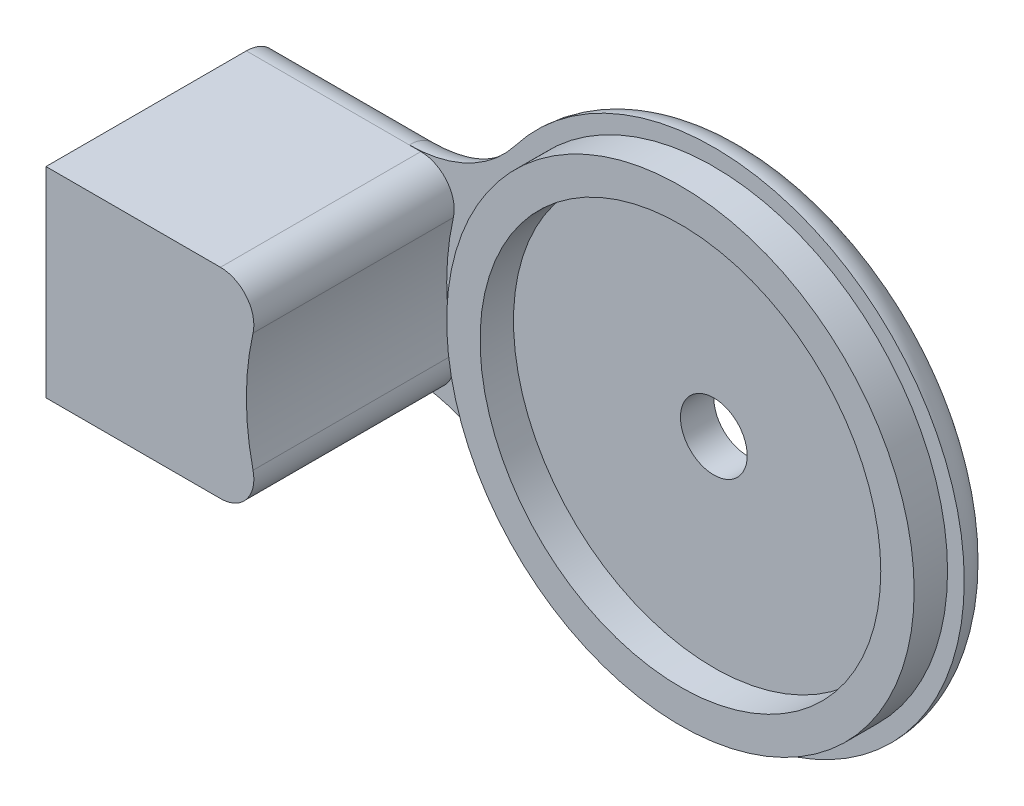
ISO-10303-21;
HEADER;
FILE_DESCRIPTION(('STEP AP214'),'2;1');
FILE_NAME('part.step','',(''),(''),'','','');
FILE_SCHEMA(('AUTOMOTIVE_DESIGN { 1 0 10303 214 1 1 1 1 }'));
ENDSEC;
DATA;
#1=APPLICATION_CONTEXT('core data for automotive mechanical design processes');
#2=APPLICATION_PROTOCOL_DEFINITION('international standard','automotive_design',2000,#1);
#3=PRODUCT_CONTEXT('',#1,'mechanical');
#4=PRODUCT('Part','Part','',(#3));
#5=PRODUCT_RELATED_PRODUCT_CATEGORY('part','',(#4));
#6=PRODUCT_DEFINITION_FORMATION('','',#4);
#7=PRODUCT_DEFINITION_CONTEXT('part definition',#1,'design');
#8=PRODUCT_DEFINITION('design','',#6,#7);
#9=PRODUCT_DEFINITION_SHAPE('','',#8);
#10=(LENGTH_UNIT() NAMED_UNIT(*) SI_UNIT(.MILLI.,.METRE.));
#11=(NAMED_UNIT(*) PLANE_ANGLE_UNIT() SI_UNIT($,.RADIAN.));
#12=(NAMED_UNIT(*) SI_UNIT($,.STERADIAN.) SOLID_ANGLE_UNIT());
#13=UNCERTAINTY_MEASURE_WITH_UNIT(LENGTH_MEASURE(1.E-05),#10,'distance_accuracy_value','');
#14=(GEOMETRIC_REPRESENTATION_CONTEXT(3) GLOBAL_UNCERTAINTY_ASSIGNED_CONTEXT((#13)) GLOBAL_UNIT_ASSIGNED_CONTEXT((#10,
#11,#12)) REPRESENTATION_CONTEXT('',''));
#15=CARTESIAN_POINT('',(0.,0.,0.));
#16=DIRECTION('',(0.,0.,1.));
#17=DIRECTION('',(1.,0.,0.));
#18=AXIS2_PLACEMENT_3D('',#15,#16,#17);
#19=CARTESIAN_POINT('',(-45.6207189772366,35.,5.));
#20=DIRECTION('',(0.,0.,1.));
#21=DIRECTION('',(1.,0.,0.));
#22=AXIS2_PLACEMENT_3D('',#19,#20,#21);
#23=PLANE('',#22);
#24=CARTESIAN_POINT('',(0.,0.,5.));
#25=DIRECTION('',(0.,0.,1.));
#26=DIRECTION('',(1.,0.,0.));
#27=AXIS2_PLACEMENT_3D('',#24,#25,#26);
#28=CIRCLE('',#27,5.);
#29=CARTESIAN_POINT('',(5.,0.,5.));
#30=VERTEX_POINT('',#29);
#31=EDGE_CURVE('E184',#30,#30,#28,.T.);
#32=ORIENTED_EDGE('',*,*,#31,.F.);
#33=EDGE_LOOP('',(#32));
#34=FACE_BOUND('',#33,.T.);
#35=CARTESIAN_POINT('',(0.,0.,5.));
#36=DIRECTION('',(0.,0.,1.));
#37=DIRECTION('',(1.,0.,0.));
#38=AXIS2_PLACEMENT_3D('',#35,#36,#37);
#39=CIRCLE('',#38,30.);
#40=CARTESIAN_POINT('',(30.,0.,5.));
#41=VERTEX_POINT('',#40);
#42=EDGE_CURVE('E197',#41,#41,#39,.F.);
#43=ORIENTED_EDGE('',*,*,#42,.F.);
#44=EDGE_LOOP('',(#43));
#45=FACE_BOUND('',#44,.T.);
#46=ADVANCED_FACE('F35',(#34,#45),#23,.T.);
#47=CARTESIAN_POINT('',(-45.6207189772366,35.,5.));
#48=DIRECTION('',(0.,0.,-1.));
#49=DIRECTION('',(1.,0.,0.));
#50=AXIS2_PLACEMENT_3D('',#47,#48,#49);
#51=CIRCLE('',#50,20.);
#52=CARTESIAN_POINT('',(-29.7526428112413,22.8260869565217,5.));
#53=VERTEX_POINT('',#52);
#54=CARTESIAN_POINT('',(-45.6207189772366,15.,5.));
#55=VERTEX_POINT('',#54);
#56=EDGE_CURVE('E126',#53,#55,#51,.T.);
#57=ORIENTED_EDGE('',*,*,#56,.T.);
#58=DIRECTION('',(-1.,0.,0.));
#59=VECTOR('',#58,1.);
#60=CARTESIAN_POINT('',(-70.0000000000001,15.,5.));
#61=LINE('',#60,#59);
#62=CARTESIAN_POINT('',(-43.8748219369606,15.,5.));
#63=VERTEX_POINT('',#62);
#64=EDGE_CURVE('E154',#63,#55,#61,.T.);
#65=ORIENTED_EDGE('',*,*,#64,.F.);
#66=CARTESIAN_POINT('',(-43.8748219369606,10.,5.));
#67=DIRECTION('',(0.,0.,1.));
#68=DIRECTION('',(-1.,0.,0.));
#69=AXIS2_PLACEMENT_3D('',#66,#67,#68);
#70=CIRCLE('',#69,5.);
#71=CARTESIAN_POINT('',(-38.9998417217428,8.88888888888889,5.));
#72=VERTEX_POINT('',#71);
#73=EDGE_CURVE('E141',#72,#63,#70,.T.);
#74=ORIENTED_EDGE('',*,*,#73,.F.);
#75=CARTESIAN_POINT('',(0.,0.,5.));
#76=DIRECTION('',(0.,0.,-1.));
#77=DIRECTION('',(1.,0.,0.));
#78=AXIS2_PLACEMENT_3D('',#75,#76,#77);
#79=CIRCLE('',#78,40.);
#80=CARTESIAN_POINT('',(-38.9998417217428,-8.88888888888889,5.));
#81=VERTEX_POINT('',#80);
#82=EDGE_CURVE('E144',#81,#72,#79,.T.);
#83=ORIENTED_EDGE('',*,*,#82,.F.);
#84=CARTESIAN_POINT('',(-43.8748219369606,-10.,5.));
#85=DIRECTION('',(0.,0.,1.));
#86=DIRECTION('',(1.,0.,0.));
#87=AXIS2_PLACEMENT_3D('',#84,#85,#86);
#88=CIRCLE('',#87,5.);
#89=CARTESIAN_POINT('',(-43.8748219369606,-15.,5.));
#90=VERTEX_POINT('',#89);
#91=EDGE_CURVE('E159',#90,#81,#88,.T.);
#92=ORIENTED_EDGE('',*,*,#91,.F.);
#93=DIRECTION('',(1.,0.,0.));
#94=VECTOR('',#93,1.);
#95=CARTESIAN_POINT('',(-70.0000000000001,-15.,5.));
#96=LINE('',#95,#94);
#97=CARTESIAN_POINT('',(-45.6207189772366,-15.,5.));
#98=VERTEX_POINT('',#97);
#99=EDGE_CURVE('E156',#98,#90,#96,.T.);
#100=ORIENTED_EDGE('',*,*,#99,.F.);
#101=CARTESIAN_POINT('',(-45.6207189772366,-35.,5.));
#102=DIRECTION('',(0.,0.,-1.));
#103=DIRECTION('',(-1.,0.,0.));
#104=AXIS2_PLACEMENT_3D('',#101,#102,#103);
#105=CIRCLE('',#104,20.);
#106=CARTESIAN_POINT('',(-29.7526428112413,-22.8260869565217,5.));
#107=VERTEX_POINT('',#106);
#108=EDGE_CURVE('E190',#98,#107,#105,.T.);
#109=ORIENTED_EDGE('',*,*,#108,.T.);
#110=CARTESIAN_POINT('',(0.,0.,5.));
#111=DIRECTION('',(0.,0.,1.));
#112=DIRECTION('',(1.,0.,0.));
#113=AXIS2_PLACEMENT_3D('',#110,#111,#112);
#114=CIRCLE('',#113,37.5);
#115=EDGE_CURVE('E192',#107,#53,#114,.T.);
#116=ORIENTED_EDGE('',*,*,#115,.T.);
#117=EDGE_LOOP('',(#57,#65,#74,#83,#92,#100,#109,#116));
#118=FACE_BOUND('',#117,.T.);
#119=CARTESIAN_POINT('',(0.,0.,5.));
#120=DIRECTION('',(0.,0.,1.));
#121=DIRECTION('',(1.,0.,0.));
#122=AXIS2_PLACEMENT_3D('',#119,#120,#121);
#123=CIRCLE('',#122,35.);
#124=CARTESIAN_POINT('',(35.,0.,5.));
#125=VERTEX_POINT('',#124);
#126=EDGE_CURVE('E177',#125,#125,#123,.T.);
#127=ORIENTED_EDGE('',*,*,#126,.F.);
#128=EDGE_LOOP('',(#127));
#129=FACE_BOUND('',#128,.T.);
#130=ADVANCED_FACE('F250',(#118,#129),#23,.T.);
#131=CARTESIAN_POINT('',(-45.6207189772366,35.,0.));
#132=DIRECTION('',(0.,0.,1.));
#133=DIRECTION('',(1.,0.,0.));
#134=AXIS2_PLACEMENT_3D('',#131,#132,#133);
#135=PLANE('',#134);
#136=CARTESIAN_POINT('',(-45.6207189772366,-35.,0.));
#137=DIRECTION('',(0.,0.,1.));
#138=DIRECTION('',(1.,0.,0.));
#139=AXIS2_PLACEMENT_3D('',#136,#137,#138);
#140=CIRCLE('',#139,25.);
#141=CARTESIAN_POINT('',(-25.7856237697425,-19.7826086956522,0.));
#142=VERTEX_POINT('',#141);
#143=CARTESIAN_POINT('',(-45.6207189772366,-10.,0.));
#144=VERTEX_POINT('',#143);
#145=EDGE_CURVE('E58',#142,#144,#140,.T.);
#146=ORIENTED_EDGE('',*,*,#145,.T.);
#147=DIRECTION('',(1.,0.,0.));
#148=VECTOR('',#147,1.);
#149=CARTESIAN_POINT('',(-45.6207189772367,-10.,0.));
#150=LINE('',#149,#148);
#151=CARTESIAN_POINT('',(-70.0000000000001,-10.,0.));
#152=VERTEX_POINT('',#151);
#153=EDGE_CURVE('E210',#144,#152,#150,.F.);
#154=ORIENTED_EDGE('',*,*,#153,.T.);
#155=DIRECTION('',(0.,-1.,0.));
#156=VECTOR('',#155,1.);
#157=CARTESIAN_POINT('',(-70.0000000000001,-15.,0.));
#158=LINE('',#157,#156);
#159=CARTESIAN_POINT('',(-70.0000000000001,10.,0.));
#160=VERTEX_POINT('',#159);
#161=EDGE_CURVE('E187',#160,#152,#158,.T.);
#162=ORIENTED_EDGE('',*,*,#161,.F.);
#163=DIRECTION('',(-1.,0.,0.));
#164=VECTOR('',#163,1.);
#165=CARTESIAN_POINT('',(-45.6207189772366,10.,0.));
#166=LINE('',#165,#164);
#167=CARTESIAN_POINT('',(-45.6207189772366,10.,0.));
#168=VERTEX_POINT('',#167);
#169=EDGE_CURVE('E203',#160,#168,#166,.F.);
#170=ORIENTED_EDGE('',*,*,#169,.T.);
#171=CARTESIAN_POINT('',(-45.6207189772366,35.,0.));
#172=DIRECTION('',(0.,0.,1.));
#173=DIRECTION('',(1.,0.,0.));
#174=AXIS2_PLACEMENT_3D('',#171,#172,#173);
#175=CIRCLE('',#174,25.);
#176=CARTESIAN_POINT('',(-25.7856237697425,19.7826086956522,0.));
#177=VERTEX_POINT('',#176);
#178=EDGE_CURVE('E205',#168,#177,#175,.T.);
#179=ORIENTED_EDGE('',*,*,#178,.T.);
#180=CARTESIAN_POINT('',(0.,0.,0.));
#181=DIRECTION('',(0.,0.,1.));
#182=DIRECTION('',(1.,0.,0.));
#183=AXIS2_PLACEMENT_3D('',#180,#181,#182);
#184=CIRCLE('',#183,32.5);
#185=EDGE_CURVE('E207',#177,#142,#184,.F.);
#186=ORIENTED_EDGE('',*,*,#185,.T.);
#187=EDGE_LOOP('',(#146,#154,#162,#170,#179,#186));
#188=FACE_BOUND('',#187,.T.);
#189=CARTESIAN_POINT('',(0.,0.,0.));
#190=DIRECTION('',(0.,0.,1.));
#191=DIRECTION('',(1.,0.,0.));
#192=AXIS2_PLACEMENT_3D('',#189,#190,#191);
#193=CIRCLE('',#192,5.);
#194=CARTESIAN_POINT('',(5.,0.,0.));
#195=VERTEX_POINT('',#194);
#196=EDGE_CURVE('E181',#195,#195,#193,.T.);
#197=ORIENTED_EDGE('',*,*,#196,.T.);
#198=EDGE_LOOP('',(#197));
#199=FACE_BOUND('',#198,.T.);
#200=ADVANCED_FACE('F235',(#188,#199),#135,.F.);
#201=CARTESIAN_POINT('',(-70.0000000000001,-15.,5.));
#202=DIRECTION('',(1.,0.,0.));
#203=DIRECTION('',(0.,0.,-1.));
#204=AXIS2_PLACEMENT_3D('',#201,#202,#203);
#205=PLANE('',#204);
#206=ORIENTED_EDGE('',*,*,#161,.T.);
#207=CARTESIAN_POINT('',(-70.0000000000001,-10.,5.));
#208=DIRECTION('',(1.,0.,0.));
#209=DIRECTION('',(0.,0.,-1.));
#210=AXIS2_PLACEMENT_3D('',#207,#208,#209);
#211=CIRCLE('',#210,5.);
#212=CARTESIAN_POINT('',(-70.0000000000001,-15.,5.));
#213=VERTEX_POINT('',#212);
#214=EDGE_CURVE('E44',#152,#213,#211,.F.);
#215=ORIENTED_EDGE('',*,*,#214,.T.);
#216=DIRECTION('',(0.,0.,-1.));
#217=VECTOR('',#216,1.);
#218=CARTESIAN_POINT('',(-70.0000000000001,-15.,5.));
#219=LINE('',#218,#217);
#220=CARTESIAN_POINT('',(-70.0000000000001,-15.,35.));
#221=VERTEX_POINT('',#220);
#222=EDGE_CURVE('E125',#221,#213,#219,.T.);
#223=ORIENTED_EDGE('',*,*,#222,.F.);
#224=DIRECTION('',(0.,-1.,0.));
#225=VECTOR('',#224,1.);
#226=CARTESIAN_POINT('',(-70.0000000000001,-15.,35.));
#227=LINE('',#226,#225);
#228=CARTESIAN_POINT('',(-70.0000000000001,15.,35.));
#229=VERTEX_POINT('',#228);
#230=EDGE_CURVE('E129',#229,#221,#227,.T.);
#231=ORIENTED_EDGE('',*,*,#230,.F.);
#232=DIRECTION('',(0.,0.,-1.));
#233=VECTOR('',#232,1.);
#234=CARTESIAN_POINT('',(-70.0000000000001,15.,5.));
#235=LINE('',#234,#233);
#236=CARTESIAN_POINT('',(-70.0000000000001,15.,5.));
#237=VERTEX_POINT('',#236);
#238=EDGE_CURVE('E117',#229,#237,#235,.T.);
#239=ORIENTED_EDGE('',*,*,#238,.T.);
#240=CARTESIAN_POINT('',(-70.0000000000001,10.,5.));
#241=DIRECTION('',(1.,0.,0.));
#242=DIRECTION('',(0.,0.,-1.));
#243=AXIS2_PLACEMENT_3D('',#240,#241,#242);
#244=CIRCLE('',#243,5.);
#245=EDGE_CURVE('E212',#237,#160,#244,.F.);
#246=ORIENTED_EDGE('',*,*,#245,.T.);
#247=EDGE_LOOP('',(#206,#215,#223,#231,#239,#246));
#248=FACE_BOUND('',#247,.T.);
#249=ADVANCED_FACE('F131',(#248),#205,.F.);
#250=CARTESIAN_POINT('',(-45.6207189772366,-15.,5.));
#251=DIRECTION('',(0.,1.,0.));
#252=DIRECTION('',(-1.,0.,0.));
#253=AXIS2_PLACEMENT_3D('',#250,#251,#252);
#254=PLANE('',#253);
#255=ORIENTED_EDGE('',*,*,#222,.T.);
#256=DIRECTION('',(1.,0.,0.));
#257=VECTOR('',#256,1.);
#258=CARTESIAN_POINT('',(-45.6207189772366,-15.,5.));
#259=LINE('',#258,#257);
#260=EDGE_CURVE('E200',#213,#98,#259,.T.);
#261=ORIENTED_EDGE('',*,*,#260,.T.);
#262=ORIENTED_EDGE('',*,*,#99,.T.);
#263=DIRECTION('',(0.,0.,-1.));
#264=VECTOR('',#263,1.);
#265=CARTESIAN_POINT('',(-43.8748219369606,-15.,35.));
#266=LINE('',#265,#264);
#267=CARTESIAN_POINT('',(-43.8748219369606,-15.,35.));
#268=VERTEX_POINT('',#267);
#269=EDGE_CURVE('E171',#268,#90,#266,.T.);
#270=ORIENTED_EDGE('',*,*,#269,.F.);
#271=DIRECTION('',(1.,0.,0.));
#272=VECTOR('',#271,1.);
#273=CARTESIAN_POINT('',(-70.0000000000001,-15.,35.));
#274=LINE('',#273,#272);
#275=EDGE_CURVE('E135',#221,#268,#274,.T.);
#276=ORIENTED_EDGE('',*,*,#275,.F.);
#277=EDGE_LOOP('',(#255,#261,#262,#270,#276));
#278=FACE_BOUND('',#277,.T.);
#279=ADVANCED_FACE('F248',(#278),#254,.F.);
#280=CARTESIAN_POINT('',(-45.6207189772366,15.,5.));
#281=DIRECTION('',(0.,-1.,0.));
#282=DIRECTION('',(1.,0.,0.));
#283=AXIS2_PLACEMENT_3D('',#280,#281,#282);
#284=PLANE('',#283);
#285=ORIENTED_EDGE('',*,*,#64,.T.);
#286=DIRECTION('',(-1.,0.,0.));
#287=VECTOR('',#286,1.);
#288=CARTESIAN_POINT('',(-45.6207189772366,15.,5.));
#289=LINE('',#288,#287);
#290=EDGE_CURVE('E11',#55,#237,#289,.T.);
#291=ORIENTED_EDGE('',*,*,#290,.T.);
#292=ORIENTED_EDGE('',*,*,#238,.F.);
#293=DIRECTION('',(-1.,0.,0.));
#294=VECTOR('',#293,1.);
#295=CARTESIAN_POINT('',(-70.0000000000001,15.,35.));
#296=LINE('',#295,#294);
#297=CARTESIAN_POINT('',(-43.8748219369606,15.,35.));
#298=VERTEX_POINT('',#297);
#299=EDGE_CURVE('E122',#298,#229,#296,.T.);
#300=ORIENTED_EDGE('',*,*,#299,.F.);
#301=DIRECTION('',(0.,0.,-1.));
#302=VECTOR('',#301,1.);
#303=CARTESIAN_POINT('',(-43.8748219369606,15.,35.));
#304=LINE('',#303,#302);
#305=EDGE_CURVE('E153',#298,#63,#304,.T.);
#306=ORIENTED_EDGE('',*,*,#305,.T.);
#307=EDGE_LOOP('',(#285,#291,#292,#300,#306));
#308=FACE_BOUND('',#307,.T.);
#309=ADVANCED_FACE('F119',(#308),#284,.F.);
#310=CARTESIAN_POINT('',(0.,0.,5.));
#311=DIRECTION('',(0.,0.,-1.));
#312=DIRECTION('',(-1.,0.,0.));
#313=AXIS2_PLACEMENT_3D('',#310,#311,#312);
#314=CYLINDRICAL_SURFACE('',#313,5.);
#315=ORIENTED_EDGE('',*,*,#31,.T.);
#316=EDGE_LOOP('',(#315));
#317=FACE_BOUND('',#316,.T.);
#318=ORIENTED_EDGE('',*,*,#196,.F.);
#319=EDGE_LOOP('',(#318));
#320=FACE_BOUND('',#319,.T.);
#321=ADVANCED_FACE('F280',(#317,#320),#314,.F.);
#322=CARTESIAN_POINT('',(0.,0.,10.));
#323=DIRECTION('',(0.,0.,1.));
#324=DIRECTION('',(1.,0.,0.));
#325=AXIS2_PLACEMENT_3D('',#322,#323,#324);
#326=PLANE('',#325);
#327=CARTESIAN_POINT('',(0.,0.,10.));
#328=DIRECTION('',(0.,0.,1.));
#329=DIRECTION('',(1.,0.,0.));
#330=AXIS2_PLACEMENT_3D('',#327,#328,#329);
#331=CIRCLE('',#330,35.);
#332=CARTESIAN_POINT('',(35.,0.,10.));
#333=VERTEX_POINT('',#332);
#334=EDGE_CURVE('E178',#333,#333,#331,.T.);
#335=ORIENTED_EDGE('',*,*,#334,.T.);
#336=EDGE_LOOP('',(#335));
#337=FACE_BOUND('',#336,.T.);
#338=CARTESIAN_POINT('',(0.,0.,10.));
#339=DIRECTION('',(0.,0.,1.));
#340=DIRECTION('',(1.,0.,0.));
#341=AXIS2_PLACEMENT_3D('',#338,#339,#340);
#342=CIRCLE('',#341,30.);
#343=CARTESIAN_POINT('',(30.,0.,10.));
#344=VERTEX_POINT('',#343);
#345=EDGE_CURVE('E174',#344,#344,#342,.T.);
#346=ORIENTED_EDGE('',*,*,#345,.F.);
#347=EDGE_LOOP('',(#346));
#348=FACE_BOUND('',#347,.T.);
#349=ADVANCED_FACE('F400',(#337,#348),#326,.T.);
#350=CARTESIAN_POINT('',(0.,0.,10.));
#351=DIRECTION('',(0.,0.,-1.));
#352=DIRECTION('',(-1.,0.,0.));
#353=AXIS2_PLACEMENT_3D('',#350,#351,#352);
#354=CYLINDRICAL_SURFACE('',#353,35.);
#355=ORIENTED_EDGE('',*,*,#334,.F.);
#356=EDGE_LOOP('',(#355));
#357=FACE_BOUND('',#356,.T.);
#358=ORIENTED_EDGE('',*,*,#126,.T.);
#359=EDGE_LOOP('',(#358));
#360=FACE_BOUND('',#359,.T.);
#361=ADVANCED_FACE('F390',(#357,#360),#354,.T.);
#362=CARTESIAN_POINT('',(0.,0.,10.));
#363=DIRECTION('',(0.,0.,-1.));
#364=DIRECTION('',(-1.,0.,0.));
#365=AXIS2_PLACEMENT_3D('',#362,#363,#364);
#366=CYLINDRICAL_SURFACE('',#365,30.);
#367=ORIENTED_EDGE('',*,*,#345,.T.);
#368=EDGE_LOOP('',(#367));
#369=FACE_BOUND('',#368,.T.);
#370=ORIENTED_EDGE('',*,*,#42,.T.);
#371=EDGE_LOOP('',(#370));
#372=FACE_BOUND('',#371,.T.);
#373=ADVANCED_FACE('F382',(#369,#372),#366,.F.);
#374=CARTESIAN_POINT('',(-43.8748219369606,-10.,35.));
#375=DIRECTION('',(0.,0.,-1.));
#376=DIRECTION('',(-1.,0.,0.));
#377=AXIS2_PLACEMENT_3D('',#374,#375,#376);
#378=CYLINDRICAL_SURFACE('',#377,5.);
#379=ORIENTED_EDGE('',*,*,#91,.T.);
#380=DIRECTION('',(0.,0.,-1.));
#381=VECTOR('',#380,1.);
#382=CARTESIAN_POINT('',(-38.9998417217428,-8.88888888888889,35.));
#383=LINE('',#382,#381);
#384=CARTESIAN_POINT('',(-38.9998417217428,-8.88888888888889,35.));
#385=VERTEX_POINT('',#384);
#386=EDGE_CURVE('E168',#385,#81,#383,.T.);
#387=ORIENTED_EDGE('',*,*,#386,.F.);
#388=CARTESIAN_POINT('',(-43.8748219369606,-10.,35.));
#389=DIRECTION('',(0.,0.,1.));
#390=DIRECTION('',(1.,0.,0.));
#391=AXIS2_PLACEMENT_3D('',#388,#389,#390);
#392=CIRCLE('',#391,5.);
#393=EDGE_CURVE('E148',#268,#385,#392,.T.);
#394=ORIENTED_EDGE('',*,*,#393,.F.);
#395=ORIENTED_EDGE('',*,*,#269,.T.);
#396=EDGE_LOOP('',(#379,#387,#394,#395));
#397=FACE_BOUND('',#396,.T.);
#398=ADVANCED_FACE('F254',(#397),#378,.T.);
#399=CARTESIAN_POINT('',(0.,0.,35.));
#400=DIRECTION('',(0.,0.,-1.));
#401=DIRECTION('',(-1.,0.,0.));
#402=AXIS2_PLACEMENT_3D('',#399,#400,#401);
#403=CYLINDRICAL_SURFACE('',#402,40.);
#404=ORIENTED_EDGE('',*,*,#82,.T.);
#405=DIRECTION('',(0.,0.,-1.));
#406=VECTOR('',#405,1.);
#407=CARTESIAN_POINT('',(-38.9998417217428,8.88888888888889,35.));
#408=LINE('',#407,#406);
#409=CARTESIAN_POINT('',(-38.9998417217428,8.88888888888889,35.));
#410=VERTEX_POINT('',#409);
#411=EDGE_CURVE('E165',#410,#72,#408,.T.);
#412=ORIENTED_EDGE('',*,*,#411,.F.);
#413=CARTESIAN_POINT('',(0.,0.,35.));
#414=DIRECTION('',(0.,0.,-1.));
#415=DIRECTION('',(1.,0.,0.));
#416=AXIS2_PLACEMENT_3D('',#413,#414,#415);
#417=CIRCLE('',#416,40.);
#418=EDGE_CURVE('E150',#385,#410,#417,.T.);
#419=ORIENTED_EDGE('',*,*,#418,.F.);
#420=ORIENTED_EDGE('',*,*,#386,.T.);
#421=EDGE_LOOP('',(#404,#412,#419,#420));
#422=FACE_BOUND('',#421,.T.);
#423=ADVANCED_FACE('F258',(#422),#403,.F.);
#424=CARTESIAN_POINT('',(-43.8748219369606,10.,35.));
#425=DIRECTION('',(0.,0.,-1.));
#426=DIRECTION('',(-1.,0.,0.));
#427=AXIS2_PLACEMENT_3D('',#424,#425,#426);
#428=CYLINDRICAL_SURFACE('',#427,5.);
#429=ORIENTED_EDGE('',*,*,#73,.T.);
#430=ORIENTED_EDGE('',*,*,#305,.F.);
#431=CARTESIAN_POINT('',(-43.8748219369606,10.,35.));
#432=DIRECTION('',(0.,0.,1.));
#433=DIRECTION('',(-1.,0.,0.));
#434=AXIS2_PLACEMENT_3D('',#431,#432,#433);
#435=CIRCLE('',#434,5.);
#436=EDGE_CURVE('E139',#410,#298,#435,.T.);
#437=ORIENTED_EDGE('',*,*,#436,.F.);
#438=ORIENTED_EDGE('',*,*,#411,.T.);
#439=EDGE_LOOP('',(#429,#430,#437,#438));
#440=FACE_BOUND('',#439,.T.);
#441=ADVANCED_FACE('F261',(#440),#428,.T.);
#442=CARTESIAN_POINT('',(-43.8748219369606,10.,35.));
#443=DIRECTION('',(0.,0.,-1.));
#444=DIRECTION('',(-1.,0.,0.));
#445=AXIS2_PLACEMENT_3D('',#442,#443,#444);
#446=PLANE('',#445);
#447=ORIENTED_EDGE('',*,*,#299,.T.);
#448=ORIENTED_EDGE('',*,*,#230,.T.);
#449=ORIENTED_EDGE('',*,*,#275,.T.);
#450=ORIENTED_EDGE('',*,*,#393,.T.);
#451=ORIENTED_EDGE('',*,*,#418,.T.);
#452=ORIENTED_EDGE('',*,*,#436,.T.);
#453=EDGE_LOOP('',(#447,#448,#449,#450,#451,#452));
#454=FACE_BOUND('',#453,.T.);
#455=ADVANCED_FACE('F137',(#454),#446,.F.);
#456=CARTESIAN_POINT('',(-45.6207189772366,10.,5.));
#457=DIRECTION('',(-1.,0.,0.));
#458=DIRECTION('',(0.,-1.,0.));
#459=AXIS2_PLACEMENT_3D('',#456,#457,#458);
#460=CYLINDRICAL_SURFACE('',#459,5.);
#461=ORIENTED_EDGE('',*,*,#245,.F.);
#462=ORIENTED_EDGE('',*,*,#290,.F.);
#463=CARTESIAN_POINT('',(-45.6207189772366,10.,5.));
#464=DIRECTION('',(1.,0.,0.));
#465=DIRECTION('',(0.,0.,-1.));
#466=AXIS2_PLACEMENT_3D('',#463,#464,#465);
#467=CIRCLE('',#466,5.);
#468=EDGE_CURVE('E39',#168,#55,#467,.T.);
#469=ORIENTED_EDGE('',*,*,#468,.F.);
#470=ORIENTED_EDGE('',*,*,#169,.F.);
#471=EDGE_LOOP('',(#461,#462,#469,#470));
#472=FACE_BOUND('',#471,.T.);
#473=ADVANCED_FACE('F37',(#472),#460,.T.);
#474=CARTESIAN_POINT('',(-45.6207189772366,35.,5.));
#475=DIRECTION('',(0.,0.,1.));
#476=DIRECTION('',(1.,0.,0.));
#477=AXIS2_PLACEMENT_3D('',#474,#475,#476);
#478=TOROIDAL_SURFACE('',#477,25.,5.);
#479=ORIENTED_EDGE('',*,*,#468,.T.);
#480=ORIENTED_EDGE('',*,*,#56,.F.);
#481=CARTESIAN_POINT('',(-25.7856237697425,19.7826086956522,5.));
#482=DIRECTION('',(0.608695652173913,0.793403808299768,0.));
#483=DIRECTION('',(-0.793403808299768,0.608695652173913,0.));
#484=AXIS2_PLACEMENT_3D('',#481,#482,#483);
#485=CIRCLE('',#484,5.);
#486=EDGE_CURVE('E219',#177,#53,#485,.T.);
#487=ORIENTED_EDGE('',*,*,#486,.F.);
#488=ORIENTED_EDGE('',*,*,#178,.F.);
#489=EDGE_LOOP('',(#479,#480,#487,#488));
#490=FACE_BOUND('',#489,.T.);
#491=ADVANCED_FACE('F230',(#490),#478,.T.);
#492=CARTESIAN_POINT('',(0.,0.,5.));
#493=DIRECTION('',(0.,0.,1.));
#494=DIRECTION('',(1.,0.,0.));
#495=AXIS2_PLACEMENT_3D('',#492,#493,#494);
#496=TOROIDAL_SURFACE('',#495,32.5,5.);
#497=ORIENTED_EDGE('',*,*,#486,.T.);
#498=ORIENTED_EDGE('',*,*,#115,.F.);
#499=CARTESIAN_POINT('',(-25.7856237697425,-19.7826086956522,5.));
#500=DIRECTION('',(-0.608695652173914,0.793403808299767,0.));
#501=DIRECTION('',(-0.793403808299767,-0.608695652173914,0.));
#502=AXIS2_PLACEMENT_3D('',#499,#500,#501);
#503=CIRCLE('',#502,5.);
#504=EDGE_CURVE('E217',#142,#107,#503,.T.);
#505=ORIENTED_EDGE('',*,*,#504,.F.);
#506=ORIENTED_EDGE('',*,*,#185,.F.);
#507=EDGE_LOOP('',(#497,#498,#505,#506));
#508=FACE_BOUND('',#507,.T.);
#509=ADVANCED_FACE('F262',(#508),#496,.T.);
#510=CARTESIAN_POINT('',(-45.6207189772366,-35.,5.));
#511=DIRECTION('',(0.,0.,1.));
#512=DIRECTION('',(1.,0.,0.));
#513=AXIS2_PLACEMENT_3D('',#510,#511,#512);
#514=TOROIDAL_SURFACE('',#513,25.,5.);
#515=ORIENTED_EDGE('',*,*,#504,.T.);
#516=ORIENTED_EDGE('',*,*,#108,.F.);
#517=CARTESIAN_POINT('',(-45.6207189772366,-10.,5.));
#518=DIRECTION('',(-1.,0.,0.));
#519=DIRECTION('',(0.,0.,1.));
#520=AXIS2_PLACEMENT_3D('',#517,#518,#519);
#521=CIRCLE('',#520,5.);
#522=EDGE_CURVE('E215',#144,#98,#521,.T.);
#523=ORIENTED_EDGE('',*,*,#522,.F.);
#524=ORIENTED_EDGE('',*,*,#145,.F.);
#525=EDGE_LOOP('',(#515,#516,#523,#524));
#526=FACE_BOUND('',#525,.T.);
#527=ADVANCED_FACE('F243',(#526),#514,.T.);
#528=CARTESIAN_POINT('',(-45.6207189772366,-10.,5.));
#529=DIRECTION('',(1.,0.,0.));
#530=DIRECTION('',(0.,1.,0.));
#531=AXIS2_PLACEMENT_3D('',#528,#529,#530);
#532=CYLINDRICAL_SURFACE('',#531,5.);
#533=ORIENTED_EDGE('',*,*,#214,.F.);
#534=ORIENTED_EDGE('',*,*,#153,.F.);
#535=ORIENTED_EDGE('',*,*,#522,.T.);
#536=ORIENTED_EDGE('',*,*,#260,.F.);
#537=EDGE_LOOP('',(#533,#534,#535,#536));
#538=FACE_BOUND('',#537,.T.);
#539=ADVANCED_FACE('F239',(#538),#532,.T.);
#540=CLOSED_SHELL('',(#46,#130,#200,#249,#279,#309,#321,#349,#361,#373,#398,#423,#441,#455,#473,
#491,#509,#527,#539));
#541=MANIFOLD_SOLID_BREP('B2',#540);
#542=ADVANCED_BREP_SHAPE_REPRESENTATION('',(#18,#541),#14);
#543=SHAPE_DEFINITION_REPRESENTATION(#9,#542);
ENDSEC;
END-ISO-10303-21;
